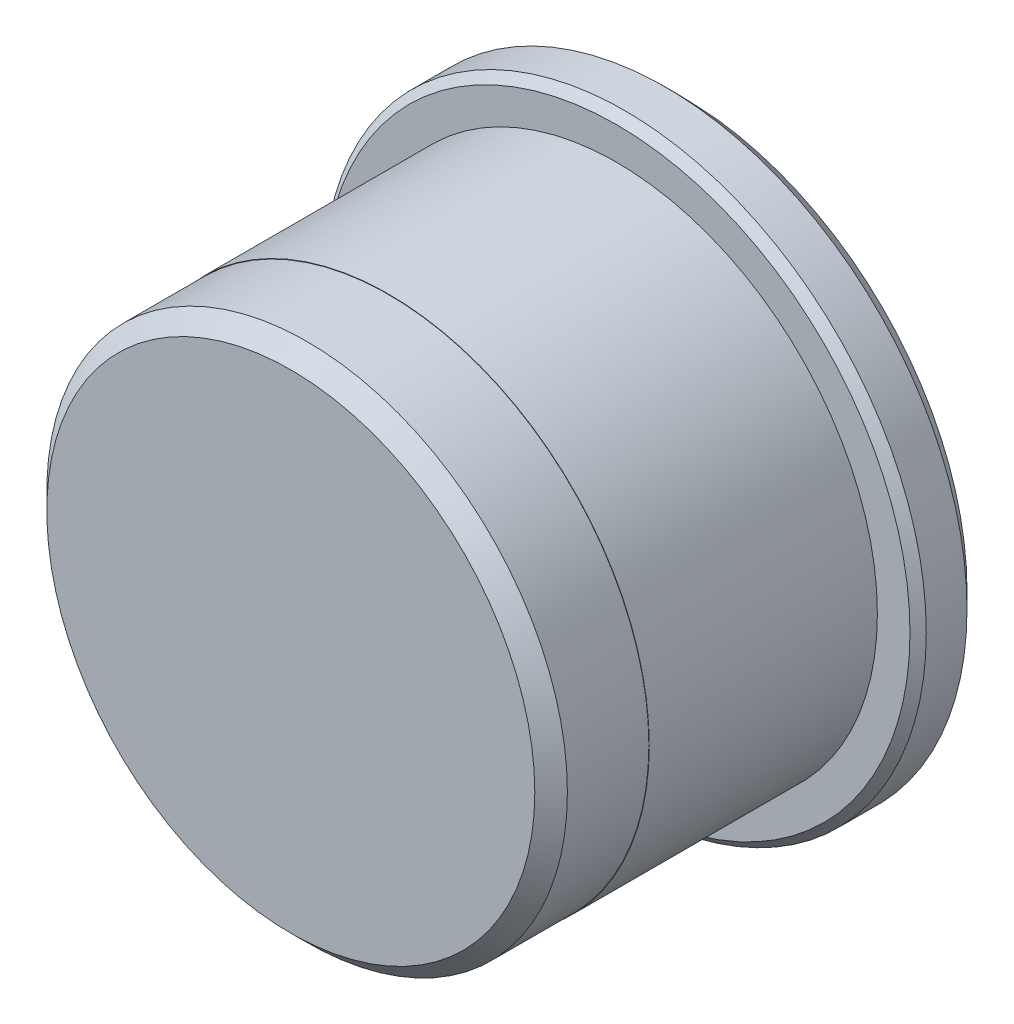
ISO-10303-21;
HEADER;
FILE_DESCRIPTION(('STEP AP214'),'2;1');
FILE_NAME('part.step','',(''),(''),'','','');
FILE_SCHEMA(('AUTOMOTIVE_DESIGN { 1 0 10303 214 1 1 1 1 }'));
ENDSEC;
DATA;
#1=APPLICATION_CONTEXT('core data for automotive mechanical design processes');
#2=APPLICATION_PROTOCOL_DEFINITION('international standard','automotive_design',2000,#1);
#3=PRODUCT_CONTEXT('',#1,'mechanical');
#4=PRODUCT('Part','Part','',(#3));
#5=PRODUCT_RELATED_PRODUCT_CATEGORY('part','',(#4));
#6=PRODUCT_DEFINITION_FORMATION('','',#4);
#7=PRODUCT_DEFINITION_CONTEXT('part definition',#1,'design');
#8=PRODUCT_DEFINITION('design','',#6,#7);
#9=PRODUCT_DEFINITION_SHAPE('','',#8);
#10=(LENGTH_UNIT() NAMED_UNIT(*) SI_UNIT(.MILLI.,.METRE.));
#11=(NAMED_UNIT(*) PLANE_ANGLE_UNIT() SI_UNIT($,.RADIAN.));
#12=(NAMED_UNIT(*) SI_UNIT($,.STERADIAN.) SOLID_ANGLE_UNIT());
#13=UNCERTAINTY_MEASURE_WITH_UNIT(LENGTH_MEASURE(1.E-05),#10,'distance_accuracy_value','');
#14=(GEOMETRIC_REPRESENTATION_CONTEXT(3) GLOBAL_UNCERTAINTY_ASSIGNED_CONTEXT((#13)) GLOBAL_UNIT_ASSIGNED_CONTEXT((#10,
#11,#12)) REPRESENTATION_CONTEXT('',''));
#15=CARTESIAN_POINT('',(0.,0.,0.));
#16=DIRECTION('',(0.,0.,1.));
#17=DIRECTION('',(1.,0.,0.));
#18=AXIS2_PLACEMENT_3D('',#15,#16,#17);
#19=CARTESIAN_POINT('',(0.,0.,-24.));
#20=DIRECTION('',(0.,0.,1.));
#21=DIRECTION('',(1.,0.,0.));
#22=AXIS2_PLACEMENT_3D('',#19,#20,#21);
#23=CONICAL_SURFACE('',#22,17.5,0.78539816339745);
#24=CARTESIAN_POINT('',(0.,0.,-23.));
#25=DIRECTION('',(0.,0.,1.));
#26=DIRECTION('',(1.,0.,0.));
#27=AXIS2_PLACEMENT_3D('',#24,#25,#26);
#28=CIRCLE('',#27,18.5);
#29=CARTESIAN_POINT('',(18.5,0.,-23.));
#30=VERTEX_POINT('',#29);
#31=EDGE_CURVE('E130',#30,#30,#28,.T.);
#32=ORIENTED_EDGE('',*,*,#31,.F.);
#33=EDGE_LOOP('',(#32));
#34=FACE_BOUND('',#33,.T.);
#35=CARTESIAN_POINT('',(14.7575540565597,-4.0835844676565,-26.1878785324577));
#36=CARTESIAN_POINT('',(14.8130430008535,-4.13838347702584,-26.1197843865904));
#37=CARTESIAN_POINT('',(14.867522377273,-4.19471491015577,-26.0521141620516));
#38=CARTESIAN_POINT('',(14.9743363240287,-4.31042420001002,-25.9176760089992));
#39=CARTESIAN_POINT('',(15.0266706747483,-4.36980236727703,-25.8509081733426));
#40=CARTESIAN_POINT('',(15.1804729299274,-4.55272609727952,-25.6517732586374));
#41=CARTESIAN_POINT('',(15.278498226193,-4.68082304775798,-25.5208706323952));
#42=CARTESIAN_POINT('',(15.4642844108714,-4.94948009338834,-25.2632726718091));
#43=CARTESIAN_POINT('',(15.5520016392034,-5.09008906008251,-25.1365967535843));
#44=CARTESIAN_POINT('',(15.7147385469321,-5.38314111113142,-24.8892073966461));
#45=CARTESIAN_POINT('',(15.7897731905523,-5.53556993485804,-24.7684870517789));
#46=CARTESIAN_POINT('',(15.9170658971218,-5.83429909525405,-24.5477281451394));
#47=CARTESIAN_POINT('',(15.9709449599974,-5.97931903117773,-24.4469002839097));
#48=CARTESIAN_POINT('',(16.0645529811064,-6.2784629011533,-24.2525698917221));
#49=CARTESIAN_POINT('',(16.104293319972,-6.43257939610127,-24.1590615166253));
#50=CARTESIAN_POINT('',(16.1686835984762,-6.75911730437596,-23.9759727701006));
#51=CARTESIAN_POINT('',(16.1922774396378,-6.9320820984464,-23.886970522829));
#52=CARTESIAN_POINT('',(16.2160744823455,-7.28620935701281,-23.7229025182111));
#53=CARTESIAN_POINT('',(16.2162910372406,-7.46736708245364,-23.6478288291947));
#54=CARTESIAN_POINT('',(16.1908594904296,-7.80346888967254,-23.5273060597569));
#55=CARTESIAN_POINT('',(16.1695746360371,-7.95767133148547,-23.4789948796656));
#56=CARTESIAN_POINT('',(16.1213218503405,-8.18857833131369,-23.4184062138683));
#57=CARTESIAN_POINT('',(16.1025131682239,-8.26549118235454,-23.4001880819207));
#58=CARTESIAN_POINT('',(16.0592795971885,-8.41861904944083,-23.3680517055014));
#59=CARTESIAN_POINT('',(16.0348572974868,-8.49483437041398,-23.3541314855815));
#60=CARTESIAN_POINT('',(15.9800997884872,-8.64654441878977,-23.3307980396964));
#61=CARTESIAN_POINT('',(15.9497178338278,-8.7220281477344,-23.32142262261));
#62=CARTESIAN_POINT('',(15.8832694108011,-8.87087860138132,-23.3075800746231));
#63=CARTESIAN_POINT('',(15.8472055899547,-8.94424629332805,-23.30311066541));
#64=CARTESIAN_POINT('',(15.7696293209817,-9.0881746446041,-23.2991908542824));
#65=CARTESIAN_POINT('',(15.7281176971854,-9.15873572651276,-23.2997396938965));
#66=CARTESIAN_POINT('',(15.6400646383478,-9.29638747875537,-23.3058316726018));
#67=CARTESIAN_POINT('',(15.5935235652834,-9.3634783983287,-23.3113744524823));
#68=CARTESIAN_POINT('',(15.4587202270609,-9.54322157480523,-23.3334137816967));
#69=CARTESIAN_POINT('',(15.3656460073233,-9.65172146892207,-23.3550349062028));
#70=CARTESIAN_POINT('',(15.1687607203122,-9.85437548119487,-23.4118612759937));
#71=CARTESIAN_POINT('',(15.0649405686463,-9.94851729227314,-23.4470780845838));
#72=CARTESIAN_POINT('',(14.8091596157996,-10.1547911735978,-23.5445561398772));
#73=CARTESIAN_POINT('',(14.6538294875234,-10.2602834228133,-23.6120081753879));
#74=CARTESIAN_POINT('',(14.3360228362177,-10.4446391652718,-23.7634868166315));
#75=CARTESIAN_POINT('',(14.1735445604017,-10.5234960857073,-23.8475175053911));
#76=CARTESIAN_POINT('',(13.9320570028089,-10.6223871401244,-23.9805220620675));
#77=CARTESIAN_POINT('',(13.8539960088239,-10.6515720302661,-24.0247480811811));
#78=CARTESIAN_POINT('',(13.7423166484547,-10.689688254535,-24.0896631402902));
#79=CARTESIAN_POINT('',(13.7088078186248,-10.7006586007213,-24.1093510702362));
#80=CARTESIAN_POINT('',(13.5395497753582,-10.7538033842157,-24.2098311720807));
#81=CARTESIAN_POINT('',(13.4035477012915,-10.7891460524024,-24.2939226008768));
#82=CARTESIAN_POINT('',(13.1322230483298,-10.8467982036128,-24.4677770166333));
#83=CARTESIAN_POINT('',(12.9969018338173,-10.8690875865695,-24.5575485157675));
#84=CARTESIAN_POINT('',(12.727674584714,-10.901923505097,-24.7418468050619));
#85=CARTESIAN_POINT('',(12.5937723770113,-10.912443754433,-24.8363837489932));
#86=CARTESIAN_POINT('',(12.3287094847803,-10.9226723818636,-25.029005975352));
#87=CARTESIAN_POINT('',(12.1975419107734,-10.9224123833322,-25.1270800362359));
#88=CARTESIAN_POINT('',(12.067855609174,-10.9172986072766,-25.2266921652567));
#89=B_SPLINE_CURVE_WITH_KNOTS('',3,(#35,#36,#37,#38,#39,#40,#41,#42,#43,#44,#45,#46,#47,#48,#49,
#50,#51,#52,#53,#54,#55,#56,#57,#58,#59,#60,#61,#62,#63,#64,#65,#66,#67,#68,#69,#70,#71,#72,#73,
#74,#75,#76,#77,#78,#79,#80,#81,#82,#83,#84,#85,#86,#87,#88),.UNSPECIFIED.,.F.,.F.,(4,2,2,2,2,2,
2,2,2,2,2,2,2,2,2,2,2,2,2,2,2,2,2,2,2,2,4),(0.,0.310558276855275,0.621148270928931,
1.24367512640777,1.86875030359388,2.49308272458422,3.04628306922645,3.59903711547219,
4.18516803661956,4.77096415191849,5.25779921343905,5.50127998572419,5.74464867983269,
5.99000865583804,6.23525464027461,6.48046355819812,6.72565483982043,7.15730991859466,
7.58933293730032,8.18456947950103,8.77995280125684,9.06285259674926,9.18399420200688,
9.67445686745939,10.1656727981252,10.6579836774957,11.1488504874221),.UNSPECIFIED.);
#90=CARTESIAN_POINT('',(16.1587384318663,-6.71901572334263,-24.));
#91=VERTEX_POINT('',#90);
#92=CARTESIAN_POINT('',(13.8982075207749,-10.634370113433,-24.));
#93=VERTEX_POINT('',#92);
#94=EDGE_CURVE('E219',#91,#93,#89,.T.);
#95=ORIENTED_EDGE('',*,*,#94,.F.);
#96=CARTESIAN_POINT('',(0.,0.,-24.));
#97=DIRECTION('',(0.,0.,1.));
#98=DIRECTION('',(1.,0.,0.));
#99=AXIS2_PLACEMENT_3D('',#96,#97,#98);
#100=CIRCLE('',#99,17.5);
#101=CARTESIAN_POINT('',(2.26053091109146,17.3533858367755,-24.));
#102=VERTEX_POINT('',#101);
#103=EDGE_CURVE('E122',#91,#102,#100,.T.);
#104=ORIENTED_EDGE('',*,*,#103,.T.);
#105=CARTESIAN_POINT('',(-2.35974404544222,17.2693235559474,-24.0702));
#106=CARTESIAN_POINT('',(-2.23171854095832,17.3811839876787,-23.9766894874939));
#107=CARTESIAN_POINT('',(-2.09432513794989,17.4877492554223,-23.8879807329315));
#108=CARTESIAN_POINT('',(-1.79960328551044,17.6857367176965,-23.7236484626884));
#109=CARTESIAN_POINT('',(-1.64208653950377,17.7769941199038,-23.6481669970949));
#110=CARTESIAN_POINT('',(-1.33724474669325,17.9235103815291,-23.5272395632901));
#111=CARTESIAN_POINT('',(-1.1928345004328,17.9822620442943,-23.4788598146987));
#112=CARTESIAN_POINT('',(-0.968604728128119,18.0559255719479,-23.4182729536407));
#113=CARTESIAN_POINT('',(-0.892694837336876,18.0780502313405,-23.4000901689655));
#114=CARTESIAN_POINT('',(-0.738678654852237,18.1171017459653,-23.3680121976114));
#115=CARTESIAN_POINT('',(-0.660573434239338,18.1340310894912,-23.3541149583574));
#116=CARTESIAN_POINT('',(-0.501952559133383,18.1624393192728,-23.3308023587351));
#117=CARTESIAN_POINT('',(-0.421421294863613,18.1738663633097,-23.3214296258951));
#118=CARTESIAN_POINT('',(-0.259349864505677,18.1907437225609,-23.307588588252));
#119=CARTESIAN_POINT('',(-0.177810177886436,18.1961967754716,-23.303118036929));
#120=CARTESIAN_POINT('',(-0.0143765867694602,18.200987011808,-23.2991907808376));
#121=CARTESIAN_POINT('',(0.0675174980128374,18.2003205925635,-23.2997370295718));
#122=CARTESIAN_POINT('',(0.230814942064338,18.1928920659289,-23.3058275461324));
#123=CARTESIAN_POINT('',(0.312218336446415,18.1861304000435,-23.3113714519572));
#124=CARTESIAN_POINT('',(0.535334303951106,18.15925248164,-23.3334160221115));
#125=CARTESIAN_POINT('',(0.675856775089886,18.1328919673818,-23.3550419211893));
#126=CARTESIAN_POINT('',(0.949800311523985,18.0637069529007,-23.4118718970451));
#127=CARTESIAN_POINT('',(1.0832174799919,18.0208735220213,-23.4470833391475));
#128=CARTESIAN_POINT('',(1.38966239052438,17.902527723093,-23.5445366031505));
#129=CARTESIAN_POINT('',(1.55863101905774,17.8207830916305,-23.6119645379244));
#130=CARTESIAN_POINT('',(1.87719381969161,17.6377635390128,-23.7634172726545));
#131=CARTESIAN_POINT('',(2.02676860876826,17.5364693269181,-23.8474584680815));
#132=CARTESIAN_POINT('',(2.23323903238624,17.3766939906451,-23.9805341507248));
#133=CARTESIAN_POINT('',(2.29756330667775,17.3236565600699,-24.0247821763303));
#134=CARTESIAN_POINT('',(2.35974404544227,17.2693235559474,-24.0702));
#135=B_SPLINE_CURVE_WITH_KNOTS('',3,(#105,#106,#107,#108,#109,#110,#111,#112,#113,#114,#115,
#116,#117,#118,#119,#120,#121,#122,#123,#124,#125,#126,#127,#128,#129,#130,#131,#132,#133,#134),
.UNSPECIFIED.,.F.,.F.,(4,2,2,2,2,2,2,2,2,2,2,2,2,2,4),(0.,0.583001874199335,1.17192497372323,
1.65944898709178,1.90258679158685,2.14560796296278,2.39087610921128,2.63603180953401,
2.88133184775156,3.12661411927094,3.55833596353691,3.99029219295577,4.58530712623776,
5.18091223243483,5.46381202792643),.UNSPECIFIED.);
#136=CARTESIAN_POINT('',(-2.26053091109146,17.3533858367755,-24.));
#137=VERTEX_POINT('',#136);
#138=EDGE_CURVE('E178',#137,#102,#135,.T.);
#139=ORIENTED_EDGE('',*,*,#138,.F.);
#140=CARTESIAN_POINT('',(-16.1587384318664,-6.7190157233424,-24.));
#141=VERTEX_POINT('',#140);
#142=EDGE_CURVE('E127',#137,#141,#100,.T.);
#143=ORIENTED_EDGE('',*,*,#142,.T.);
#144=CARTESIAN_POINT('',(-12.0678556091741,-10.9172986072765,-25.2266921652567));
#145=CARTESIAN_POINT('',(-12.2043262912928,-10.9226716108173,-25.121872435612));
#146=CARTESIAN_POINT('',(-12.3424357805075,-10.9226812106915,-25.0187521735153));
#147=CARTESIAN_POINT('',(-12.6216675510761,-10.9107363026653,-24.8164385454765));
#148=CARTESIAN_POINT('',(-12.7627982342905,-10.8987425197889,-24.7172591817066));
#149=CARTESIAN_POINT('',(-13.0490155331175,-10.8612250820318,-24.5226176217671));
#150=CARTESIAN_POINT('',(-13.1941297651493,-10.8355027858465,-24.4272326828215));
#151=CARTESIAN_POINT('',(-13.4849005542216,-10.7687953023767,-24.2432413287818));
#152=CARTESIAN_POINT('',(-13.6305560063147,-10.7278325144735,-24.1546251946304));
#153=CARTESIAN_POINT('',(-13.9382107905616,-10.6228291521664,-23.9757974407762));
#154=CARTESIAN_POINT('',(-14.1001073448342,-10.5566333530175,-23.8866349238028));
#155=CARTESIAN_POINT('',(-14.4186731548328,-10.4000861969808,-23.7226186189914));
#156=CARTESIAN_POINT('',(-14.5753620022808,-10.3098406288719,-23.6477045711732));
#157=CARTESIAN_POINT('',(-14.8533880349573,-10.1199911665658,-23.5273251470822));
#158=CARTESIAN_POINT('',(-14.9762478967589,-10.0244928023494,-23.4790282615518));
#159=CARTESIAN_POINT('',(-15.1520786468026,-9.86727870547247,-23.4184383109821));
#160=CARTESIAN_POINT('',(-15.2093041781031,-9.81251696832986,-23.4002117314873));
#161=CARTESIAN_POINT('',(-15.3203406526177,-9.69847544008766,-23.3680613121426));
#162=CARTESIAN_POINT('',(-15.3741531574259,-9.63919774294685,-23.3541354930744));
#163=CARTESIAN_POINT('',(-15.4781792909257,-9.51589746903226,-23.3307975279649));
#164=CARTESIAN_POINT('',(-15.5283612253203,-9.4518411888205,-23.3214218076748));
#165=CARTESIAN_POINT('',(-15.6240490245724,-9.31986388858168,-23.3075790874248));
#166=CARTESIAN_POINT('',(-15.6695570521742,-9.25194467885023,-23.30310980776));
#167=CARTESIAN_POINT('',(-15.7554136327731,-9.11279691942098,-23.299190862258));
#168=CARTESIAN_POINT('',(-15.7957634088726,-9.04156915971378,-23.2997400042273));
#169=CARTESIAN_POINT('',(-15.8709430578306,-8.89649315008616,-23.3058321546764));
#170=CARTESIAN_POINT('',(-15.9057733275996,-8.82264508906069,-23.3113748038789));
#171=CARTESIAN_POINT('',(-15.9940326390814,-8.61603317633334,-23.3334138234754));
#172=CARTESIAN_POINT('',(-16.0414593444056,-8.48117815822901,-23.3550350166271));
#173=CARTESIAN_POINT('',(-16.1185200759593,-8.20934327364839,-23.4118615857382));
#174=CARTESIAN_POINT('',(-16.1481390331614,-8.07236170792796,-23.447078425159));
#175=CARTESIAN_POINT('',(-16.1988860409827,-7.74771939801678,-23.54455407038));
#176=CARTESIAN_POINT('',(-16.212580175267,-7.56046118283374,-23.6120027098414));
#177=CARTESIAN_POINT('',(-16.2133348859339,-7.19304968626329,-23.7634825504093));
#178=CARTESIAN_POINT('',(-16.2003871871437,-7.01289863013164,-23.8475188964643));
#179=CARTESIAN_POINT('',(-16.1652859947047,-6.7543258041885,-23.9805200288469));
#180=CARTESIAN_POINT('',(-16.1515310493888,-6.67213801295534,-24.0247423348163));
#181=CARTESIAN_POINT('',(-16.1068074474443,-6.44531971454662,-24.1519170582775));
#182=CARTESIAN_POINT('',(-16.0708598053521,-6.3031735197888,-24.2376262445402));
#183=CARTESIAN_POINT('',(-15.9868202929322,-6.0265408050117,-24.4153693941803));
#184=CARTESIAN_POINT('',(-15.9387146852839,-5.8920631617933,-24.5074104257315));
#185=CARTESIAN_POINT('',(-15.8318559879387,-5.63020283551611,-24.6971494343711));
#186=CARTESIAN_POINT('',(-15.7730383477778,-5.50286964665694,-24.7948791194458));
#187=CARTESIAN_POINT('',(-15.6464685028286,-5.25632636086193,-24.9944944268035));
#188=CARTESIAN_POINT('',(-15.5787200129475,-5.13711291750999,-25.0963783089874));
#189=CARTESIAN_POINT('',(-15.3974803713955,-4.84571219790624,-25.3585818135568));
#190=CARTESIAN_POINT('',(-15.278755486466,-4.67887760330645,-25.5212925132676));
#191=CARTESIAN_POINT('',(-15.0901998396931,-4.44391303683647,-25.769160690025));
#192=CARTESIAN_POINT('',(-15.0260146445729,-4.36854252474132,-25.8519147891978));
#193=CARTESIAN_POINT('',(-14.8942604807413,-4.22252077962978,-26.0188508440511));
#194=CARTESIAN_POINT('',(-14.8266920450192,-4.15186880733103,-26.1030325734524));
#195=CARTESIAN_POINT('',(-14.7575540565598,-4.08358446765632,-26.1878785324577));
#196=B_SPLINE_CURVE_WITH_KNOTS('',3,(#144,#145,#146,#147,#148,#149,#150,#151,#152,#153,#154,
#155,#156,#157,#158,#159,#160,#161,#162,#163,#164,#165,#166,#167,#168,#169,#170,#171,#172,#173,
#174,#175,#176,#177,#178,#179,#180,#181,#182,#183,#184,#185,#186,#187,#188,#189,#190,#191,#192,
#193,#194,#195),.UNSPECIFIED.,.F.,.F.,(4,2,2,2,2,2,2,2,2,2,2,2,2,2,2,2,2,2,2,2,2,2,2,2,2,4),(0.,
0.516534246583944,1.03476413292146,1.56070419438451,2.08587430091433,2.67310898011182,
3.25780202277384,3.74446954241797,3.98803436137308,4.23148692371672,4.47685754723765,
4.72211411462325,4.96731241953512,5.21249308410958,5.64414975340067,6.07617118102441,
6.67138866688165,7.26679106010241,7.54969085559482,8.05824621103518,8.56737877385943,
9.0796874772509,9.59178374742753,10.3748841234763,10.761865995284,11.1487870933551),.UNSPECIFIED.);
#197=CARTESIAN_POINT('',(-13.898207520775,-10.6343701134328,-24.));
#198=VERTEX_POINT('',#197);
#199=EDGE_CURVE('E115',#198,#141,#196,.T.);
#200=ORIENTED_EDGE('',*,*,#199,.F.);
#201=EDGE_CURVE('E114',#198,#93,#100,.T.);
#202=ORIENTED_EDGE('',*,*,#201,.T.);
#203=EDGE_LOOP('',(#95,#104,#139,#143,#200,#202));
#204=FACE_BOUND('',#203,.T.);
#205=ADVANCED_FACE('F41',(#34,#204),#23,.T.);
#206=CARTESIAN_POINT('',(0.,17.5,-24.));
#207=DIRECTION('',(0.,0.,1.));
#208=DIRECTION('',(1.,0.,0.));
#209=AXIS2_PLACEMENT_3D('',#206,#207,#208);
#210=PLANE('',#209);
#211=DIRECTION('',(-0.866025403784436,0.500000000000004,0.));
#212=VECTOR('',#211,1.);
#213=CARTESIAN_POINT('',(23.0160004405518,-10.678057789961,-24.));
#214=LINE('',#213,#212);
#215=CARTESIAN_POINT('',(13.1634006642554,-4.9896566568986,-24.));
#216=VERTEX_POINT('',#215);
#217=EDGE_CURVE('E221',#216,#91,#214,.F.);
#218=ORIENTED_EDGE('',*,*,#217,.F.);
#219=CARTESIAN_POINT('',(0.,0.,-24.));
#220=DIRECTION('',(0.,0.,1.));
#221=DIRECTION('',(1.,0.,0.));
#222=AXIS2_PLACEMENT_3D('',#219,#220,#221);
#223=CIRCLE('',#222,14.0773502691896);
#224=CARTESIAN_POINT('',(2.26053091109146,13.8946677038875,-24.));
#225=VERTEX_POINT('',#224);
#226=EDGE_CURVE('E120',#216,#225,#223,.T.);
#227=ORIENTED_EDGE('',*,*,#226,.T.);
#228=DIRECTION('',(0.,-1.,0.));
#229=VECTOR('',#228,1.);
#230=CARTESIAN_POINT('',(2.26053091109146,18.5,-24.));
#231=LINE('',#230,#229);
#232=EDGE_CURVE('E224',#102,#225,#231,.T.);
#233=ORIENTED_EDGE('',*,*,#232,.F.);
#234=ORIENTED_EDGE('',*,*,#103,.F.);
#235=EDGE_LOOP('',(#218,#227,#233,#234));
#236=FACE_BOUND('',#235,.T.);
#237=ADVANCED_FACE('F194',(#236),#210,.F.);
#238=DIRECTION('',(-0.866025403784436,0.500000000000004,0.));
#239=VECTOR('',#238,1.);
#240=CARTESIAN_POINT('',(20.7554695294603,-14.5934121800514,-24.));
#241=LINE('',#240,#239);
#242=CARTESIAN_POINT('',(10.902869753164,-8.90501104698897,-24.));
#243=VERTEX_POINT('',#242);
#244=EDGE_CURVE('E61',#93,#243,#241,.T.);
#245=ORIENTED_EDGE('',*,*,#244,.F.);
#246=ORIENTED_EDGE('',*,*,#201,.F.);
#247=DIRECTION('',(0.866025403784443,0.499999999999992,0.));
#248=VECTOR('',#247,1.);
#249=CARTESIAN_POINT('',(-20.7554695294604,-14.593412180051,-24.));
#250=LINE('',#249,#248);
#251=CARTESIAN_POINT('',(-10.9028697531641,-8.90501104698882,-24.));
#252=VERTEX_POINT('',#251);
#253=EDGE_CURVE('E101',#252,#198,#250,.F.);
#254=ORIENTED_EDGE('',*,*,#253,.F.);
#255=EDGE_CURVE('E112',#252,#243,#223,.T.);
#256=ORIENTED_EDGE('',*,*,#255,.T.);
#257=EDGE_LOOP('',(#245,#246,#254,#256));
#258=FACE_BOUND('',#257,.T.);
#259=ADVANCED_FACE('F111',(#258),#210,.F.);
#260=DIRECTION('',(0.866025403784443,0.499999999999992,0.));
#261=VECTOR('',#260,1.);
#262=CARTESIAN_POINT('',(-23.0160004405518,-10.6780577899606,-24.));
#263=LINE('',#262,#261);
#264=CARTESIAN_POINT('',(-13.1634006642555,-4.98965665689842,-24.));
#265=VERTEX_POINT('',#264);
#266=EDGE_CURVE('E69',#141,#265,#263,.T.);
#267=ORIENTED_EDGE('',*,*,#266,.F.);
#268=ORIENTED_EDGE('',*,*,#142,.F.);
#269=DIRECTION('',(0.,-1.,0.));
#270=VECTOR('',#269,1.);
#271=CARTESIAN_POINT('',(-2.26053091109146,18.5,-24.));
#272=LINE('',#271,#270);
#273=CARTESIAN_POINT('',(-2.26053091109146,13.8946677038875,-24.));
#274=VERTEX_POINT('',#273);
#275=EDGE_CURVE('E188',#274,#137,#272,.F.);
#276=ORIENTED_EDGE('',*,*,#275,.F.);
#277=EDGE_CURVE('E119',#274,#265,#223,.T.);
#278=ORIENTED_EDGE('',*,*,#277,.T.);
#279=EDGE_LOOP('',(#267,#268,#276,#278));
#280=FACE_BOUND('',#279,.T.);
#281=ADVANCED_FACE('F237',(#280),#210,.F.);
#282=CARTESIAN_POINT('',(0.,0.,-23.));
#283=DIRECTION('',(0.,0.,-1.));
#284=DIRECTION('',(-1.,0.,0.));
#285=AXIS2_PLACEMENT_3D('',#282,#283,#284);
#286=CONICAL_SURFACE('',#285,13.5,0.523598775598299);
#287=CARTESIAN_POINT('',(0.,0.,-23.));
#288=DIRECTION('',(0.,0.,1.));
#289=DIRECTION('',(1.,0.,0.));
#290=AXIS2_PLACEMENT_3D('',#287,#288,#289);
#291=CIRCLE('',#290,13.5);
#292=CARTESIAN_POINT('',(13.5,0.,-23.));
#293=VERTEX_POINT('',#292);
#294=EDGE_CURVE('E123',#293,#293,#291,.T.);
#295=ORIENTED_EDGE('',*,*,#294,.T.);
#296=EDGE_LOOP('',(#295));
#297=FACE_BOUND('',#296,.T.);
#298=CARTESIAN_POINT('',(10.8745716917875,-9.00323461328482,-24.0702));
#299=CARTESIAN_POINT('',(10.8982163371431,-8.91804386947631,-24.0076390375712));
#300=CARTESIAN_POINT('',(10.924683024387,-8.83126672580267,-23.9483044324237));
#301=CARTESIAN_POINT('',(10.9828390914139,-8.65502333754297,-23.8366028175274));
#302=CARTESIAN_POINT('',(11.0145283385375,-8.56555716130882,-23.7842356308587));
#303=CARTESIAN_POINT('',(11.0826936149611,-8.38445690913849,-23.6870029884062));
#304=CARTESIAN_POINT('',(11.1191674241585,-8.29282385473037,-23.6421340751442));
#305=CARTESIAN_POINT('',(11.1964450081485,-8.10788086475899,-23.5602856119821));
#306=CARTESIAN_POINT('',(11.237248677376,-8.01457097012439,-23.5233058698043));
#307=CARTESIAN_POINT('',(11.322730736312,-7.82678328567138,-23.4575633028499));
#308=CARTESIAN_POINT('',(11.3674105739587,-7.73230507082659,-23.4288035660249));
#309=CARTESIAN_POINT('',(11.4601599541419,-7.5427964909126,-23.3797682513377));
#310=CARTESIAN_POINT('',(11.5082307715077,-7.44776593064369,-23.3594958843556));
#311=CARTESIAN_POINT('',(11.6567576120406,-7.16291636271655,-23.3117520760603));
#312=CARTESIAN_POINT('',(11.7616544373442,-6.97306414124391,-23.2972574533052));
#313=CARTESIAN_POINT('',(11.9796208177696,-6.5991465867837,-23.3035946157568));
#314=CARTESIAN_POINT('',(12.0926762988567,-6.41507203880774,-23.324366895773));
#315=CARTESIAN_POINT('',(12.2663752683441,-6.14729285092098,-23.3812677742602));
#316=CARTESIAN_POINT('',(12.3250014339375,-6.05936593486975,-23.4045493228709));
#317=CARTESIAN_POINT('',(12.4433675659619,-5.88696480832237,-23.4594895696006));
#318=CARTESIAN_POINT('',(12.5031070688459,-5.80248920563051,-23.4911448506146));
#319=CARTESIAN_POINT('',(12.6182256239309,-5.6448262146087,-23.5594528865212));
#320=CARTESIAN_POINT('',(12.6735340662954,-5.57129491123506,-23.5954351009093));
#321=CARTESIAN_POINT('',(12.7846904077077,-5.42820119562351,-23.6738714419248));
#322=CARTESIAN_POINT('',(12.8405382771609,-5.35863856708283,-23.716325215372));
#323=CARTESIAN_POINT('',(12.9525912448828,-5.224000345409,-23.8073631354714));
#324=CARTESIAN_POINT('',(13.0087962348345,-5.15892345661392,-23.8559455003686));
#325=CARTESIAN_POINT('',(13.1214288731517,-5.03368177003415,-23.9588596861972));
#326=CARTESIAN_POINT('',(13.1778565389201,-4.97351736447665,-24.0131919654251));
#327=CARTESIAN_POINT('',(13.2343157372297,-4.91603803372079,-24.0702));
#328=B_SPLINE_CURVE_WITH_KNOTS('',3,(#298,#299,#300,#301,#302,#303,#304,#305,#306,#307,#308,
#309,#310,#311,#312,#313,#314,#315,#316,#317,#318,#319,#320,#321,#322,#323,#324,#325,#326,#327),
.UNSPECIFIED.,.F.,.F.,(4,2,2,2,2,2,2,2,2,2,2,2,2,2,4),(0.,0.324826434759591,0.649644619799418,
0.974312614373934,1.29897269511928,1.62375457880884,1.94865922083713,2.59752684688742,
3.24530073835602,3.56962137921367,3.89380987677133,4.18991255921565,4.4859990878707,
4.78199973332884,5.07802398929129),.UNSPECIFIED.);
#329=EDGE_CURVE('E11',#243,#216,#328,.T.);
#330=ORIENTED_EDGE('',*,*,#329,.F.);
#331=ORIENTED_EDGE('',*,*,#255,.F.);
#332=CARTESIAN_POINT('',(-13.2343157372298,-4.9160380337206,-24.0702));
#333=CARTESIAN_POINT('',(-13.1723607116021,-4.97911026916633,-24.0076390375712));
#334=CARTESIAN_POINT('',(-13.1104428443349,-5.04541966451037,-23.9483044324237));
#335=CARTESIAN_POINT('',(-12.9868896263664,-5.18390599006972,-23.8366028175274));
#336=CARTESIAN_POINT('',(-12.9252542685299,-5.25608277122262,-23.7842356308587));
#337=CARTESIAN_POINT('',(-12.8024994877305,-5.40566575834661,-23.6870029884062));
#338=CARTESIAN_POINT('',(-12.7413798393853,-5.48306953088835,-23.6421340751442));
#339=CARTESIAN_POINT('',(-12.6198533038133,-5.64246537675252,-23.5602856119821));
#340=CARTESIAN_POINT('',(-12.5594463992491,-5.72445733818847,-23.5233058698043));
#341=CARTESIAN_POINT('',(-12.4395585234629,-5.89238081502129,-23.4575633028499));
#342=CARTESIAN_POINT('',(-12.3800779081264,-5.97831379688269,-23.4288035660249));
#343=CARTESIAN_POINT('',(-12.2623333537774,-6.15339140626365,-23.3797682513377));
#344=CARTESIAN_POINT('',(-12.2040698831316,-6.24253723541756,-23.3594958843556));
#345=CARTESIAN_POINT('',(-12.0316463413161,-6.51359003642649,-23.3117520760603));
#346=CARTESIAN_POINT('',(-11.9196779072077,-6.69935946265205,-23.2972574533052));
#347=CARTESIAN_POINT('',(-11.7048389963369,-7.07508266250149,-23.3035946157568));
#348=CARTESIAN_POINT('',(-11.6019535021431,-7.26502885514795,-23.324366895773));
#349=CARTESIAN_POINT('',(-11.4568994075721,-7.54934616927865,-23.3812677742602));
#350=CARTESIAN_POINT('',(-11.410065547392,-7.6440813760346,-23.4045493228709));
#351=CARTESIAN_POINT('',(-11.3199448581731,-7.83279001658907,-23.4594895696006));
#352=CARTESIAN_POINT('',(-11.276656591684,-7.92676374504206,-23.4911448506146));
#353=CARTESIAN_POINT('',(-11.197675713765,-8.10529083370352,-23.5594528865212));
#354=CARTESIAN_POINT('',(-11.1616499582523,-8.18995500152174,-23.5954351009093));
#355=CARTESIAN_POINT('',(-11.0933053361169,-8.35776607478227,-23.6738714419248));
#356=CARTESIAN_POINT('',(-11.0609862673733,-8.44091306274638,-23.716325215372));
#357=CARTESIAN_POINT('',(-11.0004126309443,-8.60527289019989,-23.8073631354714));
#358=CARTESIAN_POINT('',(-10.9721568870244,-8.68648628371499,-23.8559455003686));
#359=CARTESIAN_POINT('',(-10.9200107239921,-8.84664985308288,-23.9588596861972));
#360=CARTESIAN_POINT('',(-10.8961206532599,-8.9255998478933,-24.0131919654251));
#361=CARTESIAN_POINT('',(-10.8745716917876,-9.00323461328467,-24.0702));
#362=B_SPLINE_CURVE_WITH_KNOTS('',3,(#332,#333,#334,#335,#336,#337,#338,#339,#340,#341,#342,
#343,#344,#345,#346,#347,#348,#349,#350,#351,#352,#353,#354,#355,#356,#357,#358,#359,#360,#361),
.UNSPECIFIED.,.F.,.F.,(4,2,2,2,2,2,2,2,2,2,2,2,2,2,4),(0.,0.324826434759594,0.649644619799421,
0.974312614373936,1.29897269511929,1.62375457880884,1.94865922083713,2.59752684688742,
3.24530073835602,3.56962137921368,3.89380987677133,4.18991255921565,4.4859990878707,
4.78199973332885,5.0780239892913),.UNSPECIFIED.);
#363=EDGE_CURVE('E55',#265,#252,#362,.T.);
#364=ORIENTED_EDGE('',*,*,#363,.F.);
#365=ORIENTED_EDGE('',*,*,#277,.F.);
#366=CARTESIAN_POINT('',(2.35974404544222,13.9192726470055,-24.0702));
#367=CARTESIAN_POINT('',(2.27414437445892,13.8971541386427,-24.0076390375712));
#368=CARTESIAN_POINT('',(2.18575981994777,13.8766863903131,-23.9483044324237));
#369=CARTESIAN_POINT('',(2.00405053495236,13.8389293276128,-23.8366028175274));
#370=CARTESIAN_POINT('',(1.91072592999234,13.8216399325315,-23.7842356308587));
#371=CARTESIAN_POINT('',(1.71980587276927,13.7901226674852,-23.6870029884062));
#372=CARTESIAN_POINT('',(1.62221241522681,13.7758933856188,-23.6421340751442));
#373=CARTESIAN_POINT('',(1.42340829566471,13.7503462415116,-23.5602856119821));
#374=CARTESIAN_POINT('',(1.32219772187294,13.7390283083129,-23.5233058698043));
#375=CARTESIAN_POINT('',(1.11682778715081,13.7191641006927,-23.4575633028499));
#376=CARTESIAN_POINT('',(1.01266733416767,13.7106188677093,-23.4288035660249));
#377=CARTESIAN_POINT('',(0.802173399635411,13.6961878971763,-23.3797682513377));
#378=CARTESIAN_POINT('',(0.695839111623773,13.6903031660613,-23.3594958843556));
#379=CARTESIAN_POINT('',(0.374888729275384,13.6765063991431,-23.3117520760603));
#380=CARTESIAN_POINT('',(0.158023469863378,13.672423603896,-23.2972574533052));
#381=CARTESIAN_POINT('',(-0.274781821432814,13.6742292492852,-23.3035946157568));
#382=CARTESIAN_POINT('',(-0.490722796713666,13.6801008939557,-23.324366895773));
#383=CARTESIAN_POINT('',(-0.809475860772103,13.6966390201997,-23.3812677742602));
#384=CARTESIAN_POINT('',(-0.914935886545577,13.7034473109044,-23.4045493228709));
#385=CARTESIAN_POINT('',(-1.12342270778883,13.7197548249115,-23.4594895696006));
#386=CARTESIAN_POINT('',(-1.22645047716202,13.7292529506726,-23.4911448506146));
#387=CARTESIAN_POINT('',(-1.42054991016604,13.7501170483123,-23.5594528865212));
#388=CARTESIAN_POINT('',(-1.51188410804324,13.7612499127569,-23.5954351009093));
#389=CARTESIAN_POINT('',(-1.69138507159088,13.7859672704058,-23.6738714419248));
#390=CARTESIAN_POINT('',(-1.77955200978776,13.7995516298293,-23.716325215372));
#391=CARTESIAN_POINT('',(-1.9521786139386,13.8292732356089,-23.8073631354714));
#392=CARTESIAN_POINT('',(-2.03663934781021,13.845409740329,-23.8559455003686));
#393=CARTESIAN_POINT('',(-2.20141814915973,13.8803316231171,-23.9588596861972));
#394=CARTESIAN_POINT('',(-2.2817358856603,13.89911721237,-24.0131919654251));
#395=CARTESIAN_POINT('',(-2.35974404544222,13.9192726470055,-24.0702));
#396=B_SPLINE_CURVE_WITH_KNOTS('',3,(#366,#367,#368,#369,#370,#371,#372,#373,#374,#375,#376,
#377,#378,#379,#380,#381,#382,#383,#384,#385,#386,#387,#388,#389,#390,#391,#392,#393,#394,#395),
.UNSPECIFIED.,.F.,.F.,(4,2,2,2,2,2,2,2,2,2,2,2,2,2,4),(0.,0.324826434759591,0.649644619799418,
0.974312614373935,1.29897269511928,1.62375457880884,1.94865922083713,2.59752684688742,
3.24530073835602,3.56962137921367,3.89380987677133,4.18991255921565,4.4859990878707,
4.78199973332884,5.07802398929129),.UNSPECIFIED.);
#397=EDGE_CURVE('E107',#225,#274,#396,.T.);
#398=ORIENTED_EDGE('',*,*,#397,.F.);
#399=ORIENTED_EDGE('',*,*,#226,.F.);
#400=EDGE_LOOP('',(#330,#331,#364,#365,#398,#399));
#401=FACE_BOUND('',#400,.T.);
#402=ADVANCED_FACE('F117',(#297,#401),#286,.F.);
#403=CARTESIAN_POINT('',(0.,0.,0.));
#404=DIRECTION('',(0.,0.,-1.));
#405=DIRECTION('',(-1.,0.,0.));
#406=AXIS2_PLACEMENT_3D('',#403,#404,#405);
#407=PLANE('',#406);
#408=CARTESIAN_POINT('',(0.,0.,0.));
#409=DIRECTION('',(0.,0.,1.));
#410=DIRECTION('',(1.,0.,0.));
#411=AXIS2_PLACEMENT_3D('',#408,#409,#410);
#412=CIRCLE('',#411,14.975);
#413=CARTESIAN_POINT('',(14.975,0.,0.));
#414=VERTEX_POINT('',#413);
#415=EDGE_CURVE('E151',#414,#414,#412,.T.);
#416=ORIENTED_EDGE('',*,*,#415,.T.);
#417=EDGE_LOOP('',(#416));
#418=FACE_BOUND('',#417,.T.);
#419=ADVANCED_FACE('F43',(#418),#407,.F.);
#420=CARTESIAN_POINT('',(0.,0.,-1.));
#421=DIRECTION('',(0.,0.,-1.));
#422=DIRECTION('',(-1.,0.,0.));
#423=AXIS2_PLACEMENT_3D('',#420,#421,#422);
#424=CONICAL_SURFACE('',#423,15.975,0.785398163397461);
#425=ORIENTED_EDGE('',*,*,#415,.F.);
#426=EDGE_LOOP('',(#425));
#427=FACE_BOUND('',#426,.T.);
#428=CARTESIAN_POINT('',(0.,0.,-1.));
#429=DIRECTION('',(0.,0.,1.));
#430=DIRECTION('',(1.,0.,0.));
#431=AXIS2_PLACEMENT_3D('',#428,#429,#430);
#432=CIRCLE('',#431,15.975);
#433=CARTESIAN_POINT('',(15.975,0.,-1.));
#434=VERTEX_POINT('',#433);
#435=EDGE_CURVE('E148',#434,#434,#432,.T.);
#436=ORIENTED_EDGE('',*,*,#435,.T.);
#437=EDGE_LOOP('',(#436));
#438=FACE_BOUND('',#437,.T.);
#439=ADVANCED_FACE('F378',(#427,#438),#424,.T.);
#440=CARTESIAN_POINT('',(0.,0.,0.));
#441=DIRECTION('',(0.,0.,1.));
#442=DIRECTION('',(1.,0.,0.));
#443=AXIS2_PLACEMENT_3D('',#440,#441,#442);
#444=CYLINDRICAL_SURFACE('',#443,15.975);
#445=ORIENTED_EDGE('',*,*,#435,.F.);
#446=EDGE_LOOP('',(#445));
#447=FACE_BOUND('',#446,.T.);
#448=CARTESIAN_POINT('',(0.,0.,-6.));
#449=DIRECTION('',(0.,0.,1.));
#450=DIRECTION('',(1.,0.,0.));
#451=AXIS2_PLACEMENT_3D('',#448,#449,#450);
#452=CIRCLE('',#451,15.975);
#453=CARTESIAN_POINT('',(15.975,0.,-6.));
#454=VERTEX_POINT('',#453);
#455=EDGE_CURVE('E145',#454,#454,#452,.T.);
#456=ORIENTED_EDGE('',*,*,#455,.T.);
#457=EDGE_LOOP('',(#456));
#458=FACE_BOUND('',#457,.T.);
#459=ADVANCED_FACE('F369',(#447,#458),#444,.T.);
#460=CARTESIAN_POINT('',(0.,15.975,-6.));
#461=DIRECTION('',(0.,0.,-1.));
#462=DIRECTION('',(-1.,0.,0.));
#463=AXIS2_PLACEMENT_3D('',#460,#461,#462);
#464=PLANE('',#463);
#465=ORIENTED_EDGE('',*,*,#455,.F.);
#466=EDGE_LOOP('',(#465));
#467=FACE_BOUND('',#466,.T.);
#468=CARTESIAN_POINT('',(0.,0.,-6.));
#469=DIRECTION('',(0.,0.,1.));
#470=DIRECTION('',(1.,0.,0.));
#471=AXIS2_PLACEMENT_3D('',#468,#469,#470);
#472=CIRCLE('',#471,16.);
#473=CARTESIAN_POINT('',(16.,0.,-6.));
#474=VERTEX_POINT('',#473);
#475=EDGE_CURVE('E142',#474,#474,#472,.T.);
#476=ORIENTED_EDGE('',*,*,#475,.T.);
#477=EDGE_LOOP('',(#476));
#478=FACE_BOUND('',#477,.T.);
#479=ADVANCED_FACE('F360',(#467,#478),#464,.F.);
#480=CARTESIAN_POINT('',(0.,0.,0.));
#481=DIRECTION('',(0.,0.,1.));
#482=DIRECTION('',(1.,0.,0.));
#483=AXIS2_PLACEMENT_3D('',#480,#481,#482);
#484=CYLINDRICAL_SURFACE('',#483,16.);
#485=ORIENTED_EDGE('',*,*,#475,.F.);
#486=EDGE_LOOP('',(#485));
#487=FACE_BOUND('',#486,.T.);
#488=CARTESIAN_POINT('',(0.,0.,-20.));
#489=DIRECTION('',(0.,0.,1.));
#490=DIRECTION('',(1.,0.,0.));
#491=AXIS2_PLACEMENT_3D('',#488,#489,#490);
#492=CIRCLE('',#491,16.);
#493=CARTESIAN_POINT('',(16.,0.,-20.));
#494=VERTEX_POINT('',#493);
#495=EDGE_CURVE('E139',#494,#494,#492,.T.);
#496=ORIENTED_EDGE('',*,*,#495,.T.);
#497=EDGE_LOOP('',(#496));
#498=FACE_BOUND('',#497,.T.);
#499=ADVANCED_FACE('F351',(#487,#498),#484,.T.);
#500=CARTESIAN_POINT('',(0.,16.,-20.));
#501=DIRECTION('',(0.,0.,-1.));
#502=DIRECTION('',(-1.,0.,0.));
#503=AXIS2_PLACEMENT_3D('',#500,#501,#502);
#504=PLANE('',#503);
#505=ORIENTED_EDGE('',*,*,#495,.F.);
#506=EDGE_LOOP('',(#505));
#507=FACE_BOUND('',#506,.T.);
#508=CARTESIAN_POINT('',(0.,0.,-20.));
#509=DIRECTION('',(0.,0.,1.));
#510=DIRECTION('',(1.,0.,0.));
#511=AXIS2_PLACEMENT_3D('',#508,#509,#510);
#512=CIRCLE('',#511,18.);
#513=CARTESIAN_POINT('',(18.,0.,-20.));
#514=VERTEX_POINT('',#513);
#515=EDGE_CURVE('E136',#514,#514,#512,.T.);
#516=ORIENTED_EDGE('',*,*,#515,.T.);
#517=EDGE_LOOP('',(#516));
#518=FACE_BOUND('',#517,.T.);
#519=ADVANCED_FACE('F343',(#507,#518),#504,.F.);
#520=CARTESIAN_POINT('',(0.,0.,-20.5));
#521=DIRECTION('',(0.,0.,-1.));
#522=DIRECTION('',(-1.,0.,0.));
#523=AXIS2_PLACEMENT_3D('',#520,#521,#522);
#524=CONICAL_SURFACE('',#523,18.5,0.785398163397452);
#525=ORIENTED_EDGE('',*,*,#515,.F.);
#526=EDGE_LOOP('',(#525));
#527=FACE_BOUND('',#526,.T.);
#528=CARTESIAN_POINT('',(0.,0.,-20.5));
#529=DIRECTION('',(0.,0.,1.));
#530=DIRECTION('',(1.,0.,0.));
#531=AXIS2_PLACEMENT_3D('',#528,#529,#530);
#532=CIRCLE('',#531,18.5);
#533=CARTESIAN_POINT('',(18.5,0.,-20.5));
#534=VERTEX_POINT('',#533);
#535=EDGE_CURVE('E133',#534,#534,#532,.T.);
#536=ORIENTED_EDGE('',*,*,#535,.T.);
#537=EDGE_LOOP('',(#536));
#538=FACE_BOUND('',#537,.T.);
#539=ADVANCED_FACE('F335',(#527,#538),#524,.T.);
#540=CARTESIAN_POINT('',(0.,0.,0.));
#541=DIRECTION('',(0.,0.,1.));
#542=DIRECTION('',(1.,0.,0.));
#543=AXIS2_PLACEMENT_3D('',#540,#541,#542);
#544=CYLINDRICAL_SURFACE('',#543,18.5);
#545=ORIENTED_EDGE('',*,*,#535,.F.);
#546=EDGE_LOOP('',(#545));
#547=FACE_BOUND('',#546,.T.);
#548=ORIENTED_EDGE('',*,*,#31,.T.);
#549=EDGE_LOOP('',(#548));
#550=FACE_BOUND('',#549,.T.);
#551=ADVANCED_FACE('F196',(#547,#550),#544,.T.);
#552=CARTESIAN_POINT('',(0.,0.,0.));
#553=DIRECTION('',(0.,0.,1.));
#554=DIRECTION('',(1.,0.,0.));
#555=AXIS2_PLACEMENT_3D('',#552,#553,#554);
#556=CYLINDRICAL_SURFACE('',#555,13.5);
#557=ORIENTED_EDGE('',*,*,#294,.F.);
#558=EDGE_LOOP('',(#557));
#559=FACE_BOUND('',#558,.T.);
#560=CARTESIAN_POINT('',(0.,0.,-9.));
#561=DIRECTION('',(0.,0.,1.));
#562=DIRECTION('',(1.,0.,0.));
#563=AXIS2_PLACEMENT_3D('',#560,#561,#562);
#564=CIRCLE('',#563,13.5);
#565=CARTESIAN_POINT('',(13.5,0.,-9.));
#566=VERTEX_POINT('',#565);
#567=EDGE_CURVE('E432',#566,#566,#564,.T.);
#568=ORIENTED_EDGE('',*,*,#567,.T.);
#569=EDGE_LOOP('',(#568));
#570=FACE_BOUND('',#569,.T.);
#571=ADVANCED_FACE('F319',(#559,#570),#556,.F.);
#572=CARTESIAN_POINT('',(0.,13.5,-9.));
#573=DIRECTION('',(0.,0.,-1.));
#574=DIRECTION('',(-1.,0.,0.));
#575=AXIS2_PLACEMENT_3D('',#572,#573,#574);
#576=PLANE('',#575);
#577=ORIENTED_EDGE('',*,*,#567,.F.);
#578=EDGE_LOOP('',(#577));
#579=FACE_BOUND('',#578,.T.);
#580=CARTESIAN_POINT('',(0.,0.,-9.));
#581=DIRECTION('',(0.,0.,1.));
#582=DIRECTION('',(1.,0.,0.));
#583=AXIS2_PLACEMENT_3D('',#580,#581,#582);
#584=CIRCLE('',#583,13.75);
#585=CARTESIAN_POINT('',(13.75,0.,-9.));
#586=VERTEX_POINT('',#585);
#587=EDGE_CURVE('E433',#586,#586,#584,.T.);
#588=ORIENTED_EDGE('',*,*,#587,.T.);
#589=EDGE_LOOP('',(#588));
#590=FACE_BOUND('',#589,.T.);
#591=ADVANCED_FACE('F310',(#579,#590),#576,.F.);
#592=CARTESIAN_POINT('',(0.,0.,0.));
#593=DIRECTION('',(0.,0.,1.));
#594=DIRECTION('',(1.,0.,0.));
#595=AXIS2_PLACEMENT_3D('',#592,#593,#594);
#596=CYLINDRICAL_SURFACE('',#595,13.75);
#597=ORIENTED_EDGE('',*,*,#587,.F.);
#598=EDGE_LOOP('',(#597));
#599=FACE_BOUND('',#598,.T.);
#600=CARTESIAN_POINT('',(0.,0.,-7.));
#601=DIRECTION('',(0.,0.,1.));
#602=DIRECTION('',(1.,0.,0.));
#603=AXIS2_PLACEMENT_3D('',#600,#601,#602);
#604=CIRCLE('',#603,13.75);
#605=CARTESIAN_POINT('',(13.75,0.,-7.));
#606=VERTEX_POINT('',#605);
#607=EDGE_CURVE('E435',#606,#606,#604,.T.);
#608=ORIENTED_EDGE('',*,*,#607,.T.);
#609=EDGE_LOOP('',(#608));
#610=FACE_BOUND('',#609,.T.);
#611=ADVANCED_FACE('F301',(#599,#610),#596,.F.);
#612=CARTESIAN_POINT('',(0.,13.75,-7.));
#613=DIRECTION('',(0.,0.,1.));
#614=DIRECTION('',(1.,0.,0.));
#615=AXIS2_PLACEMENT_3D('',#612,#613,#614);
#616=PLANE('',#615);
#617=ORIENTED_EDGE('',*,*,#607,.F.);
#618=EDGE_LOOP('',(#617));
#619=FACE_BOUND('',#618,.T.);
#620=CARTESIAN_POINT('',(0.,0.,-7.));
#621=DIRECTION('',(0.,0.,1.));
#622=DIRECTION('',(1.,0.,0.));
#623=AXIS2_PLACEMENT_3D('',#620,#621,#622);
#624=CIRCLE('',#623,11.);
#625=CARTESIAN_POINT('',(11.,0.,-7.));
#626=VERTEX_POINT('',#625);
#627=EDGE_CURVE('E440',#626,#626,#624,.T.);
#628=ORIENTED_EDGE('',*,*,#627,.T.);
#629=EDGE_LOOP('',(#628));
#630=FACE_BOUND('',#629,.T.);
#631=ADVANCED_FACE('F292',(#619,#630),#616,.F.);
#632=CARTESIAN_POINT('',(0.,0.,0.));
#633=DIRECTION('',(0.,0.,1.));
#634=DIRECTION('',(1.,0.,0.));
#635=AXIS2_PLACEMENT_3D('',#632,#633,#634);
#636=CYLINDRICAL_SURFACE('',#635,11.);
#637=ORIENTED_EDGE('',*,*,#627,.F.);
#638=EDGE_LOOP('',(#637));
#639=FACE_BOUND('',#638,.T.);
#640=CARTESIAN_POINT('',(0.,0.,-5.));
#641=DIRECTION('',(0.,0.,1.));
#642=DIRECTION('',(1.,0.,0.));
#643=AXIS2_PLACEMENT_3D('',#640,#641,#642);
#644=CIRCLE('',#643,11.);
#645=CARTESIAN_POINT('',(11.,0.,-5.));
#646=VERTEX_POINT('',#645);
#647=EDGE_CURVE('E442',#646,#646,#644,.T.);
#648=ORIENTED_EDGE('',*,*,#647,.T.);
#649=EDGE_LOOP('',(#648));
#650=FACE_BOUND('',#649,.T.);
#651=ADVANCED_FACE('F284',(#639,#650),#636,.F.);
#652=CARTESIAN_POINT('',(0.,11.,-5.));
#653=DIRECTION('',(0.,0.,1.));
#654=DIRECTION('',(1.,0.,0.));
#655=AXIS2_PLACEMENT_3D('',#652,#653,#654);
#656=PLANE('',#655);
#657=ORIENTED_EDGE('',*,*,#647,.F.);
#658=EDGE_LOOP('',(#657));
#659=FACE_BOUND('',#658,.T.);
#660=CARTESIAN_POINT('',(0.,0.,-5.));
#661=DIRECTION('',(0.,0.,1.));
#662=DIRECTION('',(1.,0.,0.));
#663=AXIS2_PLACEMENT_3D('',#660,#661,#662);
#664=CIRCLE('',#663,1.5);
#665=CARTESIAN_POINT('',(1.5,0.,-5.));
#666=VERTEX_POINT('',#665);
#667=EDGE_CURVE('E187',#666,#666,#664,.T.);
#668=ORIENTED_EDGE('',*,*,#667,.T.);
#669=EDGE_LOOP('',(#668));
#670=FACE_BOUND('',#669,.T.);
#671=ADVANCED_FACE('F276',(#659,#670),#656,.F.);
#672=CARTESIAN_POINT('',(0.,0.,-4.09870907145866));
#673=DIRECTION('',(0.,0.,-1.));
#674=DIRECTION('',(-1.,0.,0.));
#675=AXIS2_PLACEMENT_3D('',#672,#673,#674);
#676=CONICAL_SURFACE('',#675,0.,1.02974425867666);
#677=ORIENTED_EDGE('',*,*,#667,.F.);
#678=EDGE_LOOP('',(#677));
#679=FACE_BOUND('',#678,.T.);
#680=CARTESIAN_POINT('',(0.,0.,-4.09870907145866));
#681=VERTEX_POINT('',#680);
#682=VERTEX_LOOP('',#681);
#683=FACE_BOUND('',#682,.T.);
#684=ADVANCED_FACE('F171',(#679,#683),#676,.F.);
#685=CARTESIAN_POINT('',(0.,18.5,-27.3));
#686=DIRECTION('',(0.,-1.,0.));
#687=DIRECTION('',(0.,0.,-1.));
#688=AXIS2_PLACEMENT_3D('',#685,#686,#687);
#689=CYLINDRICAL_SURFACE('',#688,3.99999999999999);
#690=ORIENTED_EDGE('',*,*,#138,.T.);
#691=ORIENTED_EDGE('',*,*,#232,.T.);
#692=ORIENTED_EDGE('',*,*,#397,.T.);
#693=ORIENTED_EDGE('',*,*,#275,.T.);
#694=EDGE_LOOP('',(#690,#691,#692,#693));
#695=FACE_BOUND('',#694,.T.);
#696=ADVANCED_FACE('F167',(#695),#689,.F.);
#697=CARTESIAN_POINT('',(-21.8857349850061,-12.6357349850058,-27.3));
#698=DIRECTION('',(0.866025403784443,0.499999999999992,0.));
#699=DIRECTION('',(-0.499999999999992,0.866025403784443,0.));
#700=AXIS2_PLACEMENT_3D('',#697,#698,#699);
#701=CYLINDRICAL_SURFACE('',#700,3.99999999999999);
#702=ORIENTED_EDGE('',*,*,#199,.T.);
#703=ORIENTED_EDGE('',*,*,#266,.T.);
#704=ORIENTED_EDGE('',*,*,#363,.T.);
#705=ORIENTED_EDGE('',*,*,#253,.T.);
#706=EDGE_LOOP('',(#702,#703,#704,#705));
#707=FACE_BOUND('',#706,.T.);
#708=ADVANCED_FACE('F100',(#707),#701,.F.);
#709=CARTESIAN_POINT('',(21.885734985006,-12.6357349850062,-27.3));
#710=DIRECTION('',(-0.866025403784436,0.500000000000004,0.));
#711=DIRECTION('',(-0.500000000000004,-0.866025403784436,0.));
#712=AXIS2_PLACEMENT_3D('',#709,#710,#711);
#713=CYLINDRICAL_SURFACE('',#712,3.99999999999999);
#714=ORIENTED_EDGE('',*,*,#94,.T.);
#715=ORIENTED_EDGE('',*,*,#244,.T.);
#716=ORIENTED_EDGE('',*,*,#329,.T.);
#717=ORIENTED_EDGE('',*,*,#217,.T.);
#718=EDGE_LOOP('',(#714,#715,#716,#717));
#719=FACE_BOUND('',#718,.T.);
#720=ADVANCED_FACE('F173',(#719),#713,.F.);
#721=CLOSED_SHELL('',(#205,#237,#259,#281,#402,#419,#439,#459,#479,#499,#519,#539,#551,#571,
#591,#611,#631,#651,#671,#684,#696,#708,#720));
#722=MANIFOLD_SOLID_BREP('B2',#721);
#723=ADVANCED_BREP_SHAPE_REPRESENTATION('',(#18,#722),#14);
#724=SHAPE_DEFINITION_REPRESENTATION(#9,#723);
ENDSEC;
END-ISO-10303-21;
